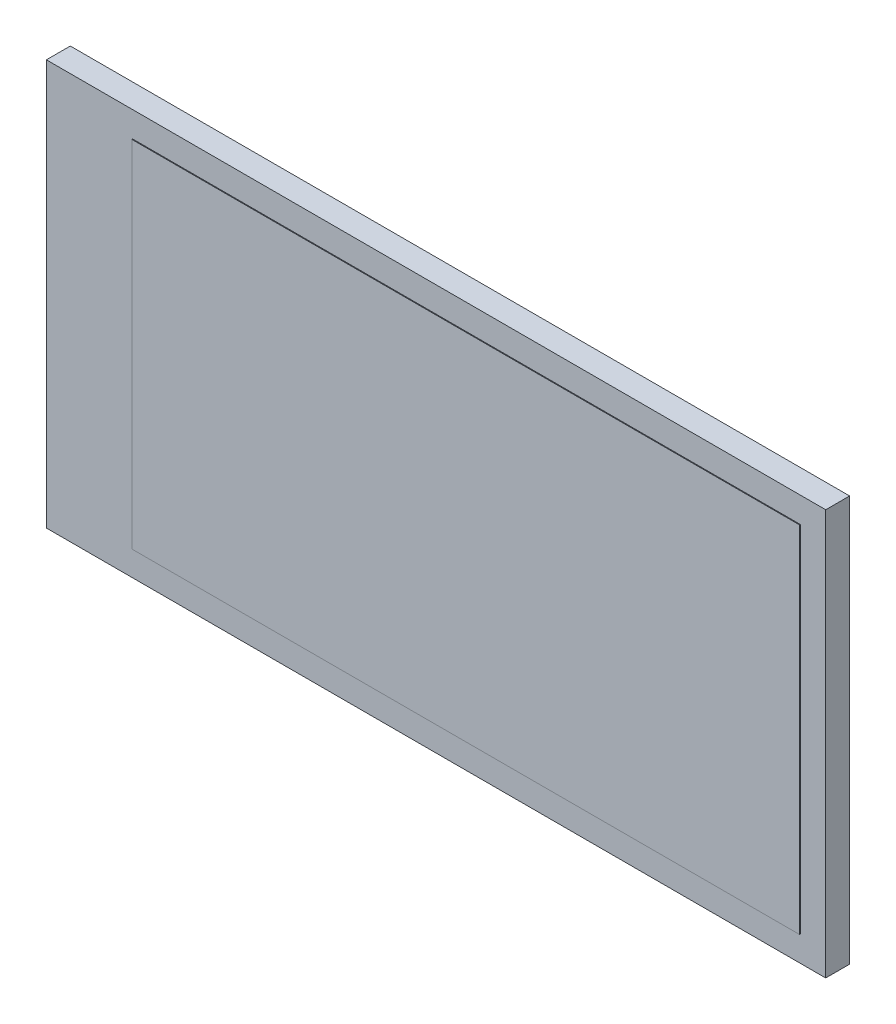
ISO-10303-21;
HEADER;
FILE_DESCRIPTION(('STEP AP214'),'2;1');
FILE_NAME('part.step','',(''),(''),'','','');
FILE_SCHEMA(('AUTOMOTIVE_DESIGN { 1 0 10303 214 1 1 1 1 }'));
ENDSEC;
DATA;
#1=APPLICATION_CONTEXT('core data for automotive mechanical design processes');
#2=APPLICATION_PROTOCOL_DEFINITION('international standard','automotive_design',2000,#1);
#3=PRODUCT_CONTEXT('',#1,'mechanical');
#4=PRODUCT('Part','Part','',(#3));
#5=PRODUCT_RELATED_PRODUCT_CATEGORY('part','',(#4));
#6=PRODUCT_DEFINITION_FORMATION('','',#4);
#7=PRODUCT_DEFINITION_CONTEXT('part definition',#1,'design');
#8=PRODUCT_DEFINITION('design','',#6,#7);
#9=PRODUCT_DEFINITION_SHAPE('','',#8);
#10=(LENGTH_UNIT() NAMED_UNIT(*) SI_UNIT(.MILLI.,.METRE.));
#11=(NAMED_UNIT(*) PLANE_ANGLE_UNIT() SI_UNIT($,.RADIAN.));
#12=(NAMED_UNIT(*) SI_UNIT($,.STERADIAN.) SOLID_ANGLE_UNIT());
#13=UNCERTAINTY_MEASURE_WITH_UNIT(LENGTH_MEASURE(1.E-05),#10,'distance_accuracy_value','');
#14=(GEOMETRIC_REPRESENTATION_CONTEXT(3) GLOBAL_UNCERTAINTY_ASSIGNED_CONTEXT((#13)) GLOBAL_UNIT_ASSIGNED_CONTEXT((#10,
#11,#12)) REPRESENTATION_CONTEXT('',''));
#15=CARTESIAN_POINT('',(0.,0.,0.));
#16=DIRECTION('',(0.,0.,1.));
#17=DIRECTION('',(1.,0.,0.));
#18=AXIS2_PLACEMENT_3D('',#15,#16,#17);
#19=CARTESIAN_POINT('',(0.,0.,1.53));
#20=DIRECTION('',(0.,0.,-1.));
#21=DIRECTION('',(-1.,0.,0.));
#22=AXIS2_PLACEMENT_3D('',#19,#20,#21);
#23=PLANE('',#22);
#24=DIRECTION('',(0.,1.,0.));
#25=VECTOR('',#24,1.);
#26=CARTESIAN_POINT('',(24.935,-12.975,1.53));
#27=LINE('',#26,#25);
#28=CARTESIAN_POINT('',(24.935,-12.975,1.53));
#29=VERTEX_POINT('',#28);
#30=CARTESIAN_POINT('',(24.935,12.975,1.53));
#31=VERTEX_POINT('',#30);
#32=EDGE_CURVE('E140',#29,#31,#27,.T.);
#33=ORIENTED_EDGE('',*,*,#32,.T.);
#34=DIRECTION('',(-1.,0.,0.));
#35=VECTOR('',#34,1.);
#36=CARTESIAN_POINT('',(-24.935,12.975,1.53));
#37=LINE('',#36,#35);
#38=CARTESIAN_POINT('',(-24.935,12.975,1.53));
#39=VERTEX_POINT('',#38);
#40=EDGE_CURVE('E144',#31,#39,#37,.T.);
#41=ORIENTED_EDGE('',*,*,#40,.T.);
#42=DIRECTION('',(0.,-1.,0.));
#43=VECTOR('',#42,1.);
#44=CARTESIAN_POINT('',(-24.935,-12.975,1.53));
#45=LINE('',#44,#43);
#46=CARTESIAN_POINT('',(-24.935,-12.975,1.53));
#47=VERTEX_POINT('',#46);
#48=EDGE_CURVE('E148',#39,#47,#45,.T.);
#49=ORIENTED_EDGE('',*,*,#48,.T.);
#50=DIRECTION('',(1.,0.,0.));
#51=VECTOR('',#50,1.);
#52=CARTESIAN_POINT('',(-24.935,-12.975,1.53));
#53=LINE('',#52,#51);
#54=EDGE_CURVE('E151',#47,#29,#53,.T.);
#55=ORIENTED_EDGE('',*,*,#54,.T.);
#56=EDGE_LOOP('',(#33,#41,#49,#55));
#57=FACE_BOUND('',#56,.T.);
#58=DIRECTION('',(0.,1.,0.));
#59=VECTOR('',#58,1.);
#60=CARTESIAN_POINT('',(23.3068668653562,11.3480878409807,1.53));
#61=LINE('',#60,#59);
#62=CARTESIAN_POINT('',(23.3068668653562,-11.3519121590193,1.53));
#63=VERTEX_POINT('',#62);
#64=CARTESIAN_POINT('',(23.3068668653562,11.3480878409807,1.53));
#65=VERTEX_POINT('',#64);
#66=EDGE_CURVE('E54',#63,#65,#61,.T.);
#67=ORIENTED_EDGE('',*,*,#66,.F.);
#68=DIRECTION('',(1.,0.,0.));
#69=VECTOR('',#68,1.);
#70=CARTESIAN_POINT('',(-19.4131331346438,-11.3519121590193,1.53));
#71=LINE('',#70,#69);
#72=CARTESIAN_POINT('',(-19.4131331346438,-11.3519121590193,1.53));
#73=VERTEX_POINT('',#72);
#74=EDGE_CURVE('E58',#73,#63,#71,.T.);
#75=ORIENTED_EDGE('',*,*,#74,.F.);
#76=DIRECTION('',(0.,-1.,0.));
#77=VECTOR('',#76,1.);
#78=CARTESIAN_POINT('',(-19.4131331346438,11.3480878409807,1.53));
#79=LINE('',#78,#77);
#80=CARTESIAN_POINT('',(-19.4131331346438,11.3480878409807,1.53));
#81=VERTEX_POINT('',#80);
#82=EDGE_CURVE('E297',#81,#73,#79,.T.);
#83=ORIENTED_EDGE('',*,*,#82,.F.);
#84=DIRECTION('',(-1.,0.,0.));
#85=VECTOR('',#84,1.);
#86=CARTESIAN_POINT('',(-19.4131331346438,11.3480878409807,1.53));
#87=LINE('',#86,#85);
#88=EDGE_CURVE('E307',#65,#81,#87,.T.);
#89=ORIENTED_EDGE('',*,*,#88,.F.);
#90=EDGE_LOOP('',(#67,#75,#83,#89));
#91=FACE_BOUND('',#90,.T.);
#92=ADVANCED_FACE('F38',(#57,#91),#23,.F.);
#93=CARTESIAN_POINT('',(24.935,-12.975,1.53));
#94=DIRECTION('',(-1.,0.,0.));
#95=DIRECTION('',(0.,0.,1.));
#96=AXIS2_PLACEMENT_3D('',#93,#94,#95);
#97=PLANE('',#96);
#98=DIRECTION('',(0.,1.,0.));
#99=VECTOR('',#98,1.);
#100=CARTESIAN_POINT('',(24.935,-12.975,0.));
#101=LINE('',#100,#99);
#102=CARTESIAN_POINT('',(24.935,-12.975,0.));
#103=VERTEX_POINT('',#102);
#104=CARTESIAN_POINT('',(24.935,12.975,0.));
#105=VERTEX_POINT('',#104);
#106=EDGE_CURVE('E127',#103,#105,#101,.T.);
#107=ORIENTED_EDGE('',*,*,#106,.T.);
#108=DIRECTION('',(0.,0.,-1.));
#109=VECTOR('',#108,1.);
#110=CARTESIAN_POINT('',(24.935,12.975,1.53));
#111=LINE('',#110,#109);
#112=EDGE_CURVE('E11',#31,#105,#111,.T.);
#113=ORIENTED_EDGE('',*,*,#112,.F.);
#114=ORIENTED_EDGE('',*,*,#32,.F.);
#115=DIRECTION('',(0.,0.,-1.));
#116=VECTOR('',#115,1.);
#117=CARTESIAN_POINT('',(24.935,-12.975,1.53));
#118=LINE('',#117,#116);
#119=EDGE_CURVE('E153',#29,#103,#118,.T.);
#120=ORIENTED_EDGE('',*,*,#119,.T.);
#121=EDGE_LOOP('',(#107,#113,#114,#120));
#122=FACE_BOUND('',#121,.T.);
#123=ADVANCED_FACE('F40',(#122),#97,.F.);
#124=CARTESIAN_POINT('',(-24.935,12.975,1.53));
#125=DIRECTION('',(0.,-1.,0.));
#126=DIRECTION('',(0.,0.,-1.));
#127=AXIS2_PLACEMENT_3D('',#124,#125,#126);
#128=PLANE('',#127);
#129=DIRECTION('',(-1.,0.,0.));
#130=VECTOR('',#129,1.);
#131=CARTESIAN_POINT('',(-24.935,12.975,0.));
#132=LINE('',#131,#130);
#133=CARTESIAN_POINT('',(-24.935,12.975,0.));
#134=VERTEX_POINT('',#133);
#135=EDGE_CURVE('E133',#105,#134,#132,.T.);
#136=ORIENTED_EDGE('',*,*,#135,.T.);
#137=DIRECTION('',(0.,0.,-1.));
#138=VECTOR('',#137,1.);
#139=CARTESIAN_POINT('',(-24.935,12.975,1.53));
#140=LINE('',#139,#138);
#141=EDGE_CURVE('E47',#39,#134,#140,.T.);
#142=ORIENTED_EDGE('',*,*,#141,.F.);
#143=ORIENTED_EDGE('',*,*,#40,.F.);
#144=ORIENTED_EDGE('',*,*,#112,.T.);
#145=EDGE_LOOP('',(#136,#142,#143,#144));
#146=FACE_BOUND('',#145,.T.);
#147=ADVANCED_FACE('F187',(#146),#128,.F.);
#148=CARTESIAN_POINT('',(-24.935,-12.975,1.53));
#149=DIRECTION('',(1.,0.,0.));
#150=DIRECTION('',(0.,0.,-1.));
#151=AXIS2_PLACEMENT_3D('',#148,#149,#150);
#152=PLANE('',#151);
#153=DIRECTION('',(0.,-1.,0.));
#154=VECTOR('',#153,1.);
#155=CARTESIAN_POINT('',(-24.935,-12.975,0.));
#156=LINE('',#155,#154);
#157=CARTESIAN_POINT('',(-24.935,-12.975,0.));
#158=VERTEX_POINT('',#157);
#159=EDGE_CURVE('E157',#134,#158,#156,.T.);
#160=ORIENTED_EDGE('',*,*,#159,.T.);
#161=DIRECTION('',(0.,0.,-1.));
#162=VECTOR('',#161,1.);
#163=CARTESIAN_POINT('',(-24.935,-12.975,1.53));
#164=LINE('',#163,#162);
#165=EDGE_CURVE('E164',#47,#158,#164,.T.);
#166=ORIENTED_EDGE('',*,*,#165,.F.);
#167=ORIENTED_EDGE('',*,*,#48,.F.);
#168=ORIENTED_EDGE('',*,*,#141,.T.);
#169=EDGE_LOOP('',(#160,#166,#167,#168));
#170=FACE_BOUND('',#169,.T.);
#171=ADVANCED_FACE('F172',(#170),#152,.F.);
#172=CARTESIAN_POINT('',(-24.935,-12.975,1.53));
#173=DIRECTION('',(0.,1.,0.));
#174=DIRECTION('',(0.,0.,1.));
#175=AXIS2_PLACEMENT_3D('',#172,#173,#174);
#176=PLANE('',#175);
#177=DIRECTION('',(1.,0.,0.));
#178=VECTOR('',#177,1.);
#179=CARTESIAN_POINT('',(-24.935,-12.975,0.));
#180=LINE('',#179,#178);
#181=EDGE_CURVE('E145',#158,#103,#180,.T.);
#182=ORIENTED_EDGE('',*,*,#181,.T.);
#183=ORIENTED_EDGE('',*,*,#119,.F.);
#184=ORIENTED_EDGE('',*,*,#54,.F.);
#185=ORIENTED_EDGE('',*,*,#165,.T.);
#186=EDGE_LOOP('',(#182,#183,#184,#185));
#187=FACE_BOUND('',#186,.T.);
#188=ADVANCED_FACE('F181',(#187),#176,.F.);
#189=CARTESIAN_POINT('',(0.,0.,0.));
#190=DIRECTION('',(0.,0.,-1.));
#191=DIRECTION('',(-1.,0.,0.));
#192=AXIS2_PLACEMENT_3D('',#189,#190,#191);
#193=PLANE('',#192);
#194=ORIENTED_EDGE('',*,*,#106,.F.);
#195=ORIENTED_EDGE('',*,*,#181,.F.);
#196=ORIENTED_EDGE('',*,*,#159,.F.);
#197=ORIENTED_EDGE('',*,*,#135,.F.);
#198=EDGE_LOOP('',(#194,#195,#196,#197));
#199=FACE_BOUND('',#198,.T.);
#200=ADVANCED_FACE('F178',(#199),#193,.T.);
#201=CARTESIAN_POINT('',(23.3068668653562,11.3480878409807,1.58));
#202=DIRECTION('',(-1.,0.,0.));
#203=DIRECTION('',(0.,-1.,0.));
#204=AXIS2_PLACEMENT_3D('',#201,#202,#203);
#205=PLANE('',#204);
#206=ORIENTED_EDGE('',*,*,#66,.T.);
#207=DIRECTION('',(0.,0.,-1.));
#208=VECTOR('',#207,1.);
#209=CARTESIAN_POINT('',(23.3068668653562,11.3480878409807,1.58));
#210=LINE('',#209,#208);
#211=CARTESIAN_POINT('',(23.3068668653562,11.3480878409807,1.58));
#212=VERTEX_POINT('',#211);
#213=EDGE_CURVE('E107',#212,#65,#210,.T.);
#214=ORIENTED_EDGE('',*,*,#213,.F.);
#215=DIRECTION('',(0.,1.,0.));
#216=VECTOR('',#215,1.);
#217=CARTESIAN_POINT('',(23.3068668653562,11.3480878409807,1.58));
#218=LINE('',#217,#216);
#219=CARTESIAN_POINT('',(23.3068668653562,-11.3519121590193,1.58));
#220=VERTEX_POINT('',#219);
#221=EDGE_CURVE('E114',#220,#212,#218,.T.);
#222=ORIENTED_EDGE('',*,*,#221,.F.);
#223=DIRECTION('',(0.,0.,-1.));
#224=VECTOR('',#223,1.);
#225=CARTESIAN_POINT('',(23.3068668653562,-11.3519121590193,1.58));
#226=LINE('',#225,#224);
#227=EDGE_CURVE('E294',#220,#63,#226,.T.);
#228=ORIENTED_EDGE('',*,*,#227,.T.);
#229=EDGE_LOOP('',(#206,#214,#222,#228));
#230=FACE_BOUND('',#229,.T.);
#231=ADVANCED_FACE('F125',(#230),#205,.F.);
#232=CARTESIAN_POINT('',(-19.4131331346438,11.3480878409807,1.58));
#233=DIRECTION('',(0.,-1.,0.));
#234=DIRECTION('',(0.,0.,-1.));
#235=AXIS2_PLACEMENT_3D('',#232,#233,#234);
#236=PLANE('',#235);
#237=ORIENTED_EDGE('',*,*,#88,.T.);
#238=DIRECTION('',(0.,0.,-1.));
#239=VECTOR('',#238,1.);
#240=CARTESIAN_POINT('',(-19.4131331346438,11.3480878409807,1.58));
#241=LINE('',#240,#239);
#242=CARTESIAN_POINT('',(-19.4131331346438,11.3480878409807,1.58));
#243=VERTEX_POINT('',#242);
#244=EDGE_CURVE('E109',#243,#81,#241,.T.);
#245=ORIENTED_EDGE('',*,*,#244,.F.);
#246=DIRECTION('',(-1.,0.,0.));
#247=VECTOR('',#246,1.);
#248=CARTESIAN_POINT('',(-19.4131331346438,11.3480878409807,1.58));
#249=LINE('',#248,#247);
#250=EDGE_CURVE('E102',#212,#243,#249,.T.);
#251=ORIENTED_EDGE('',*,*,#250,.F.);
#252=ORIENTED_EDGE('',*,*,#213,.T.);
#253=EDGE_LOOP('',(#237,#245,#251,#252));
#254=FACE_BOUND('',#253,.T.);
#255=ADVANCED_FACE('F105',(#254),#236,.F.);
#256=CARTESIAN_POINT('',(-19.4131331346438,11.3480878409807,1.58));
#257=DIRECTION('',(1.,0.,0.));
#258=DIRECTION('',(0.,1.,0.));
#259=AXIS2_PLACEMENT_3D('',#256,#257,#258);
#260=PLANE('',#259);
#261=ORIENTED_EDGE('',*,*,#82,.T.);
#262=DIRECTION('',(0.,0.,-1.));
#263=VECTOR('',#262,1.);
#264=CARTESIAN_POINT('',(-19.4131331346438,-11.3519121590193,1.58));
#265=LINE('',#264,#263);
#266=CARTESIAN_POINT('',(-19.4131331346438,-11.3519121590193,1.58));
#267=VERTEX_POINT('',#266);
#268=EDGE_CURVE('E136',#267,#73,#265,.T.);
#269=ORIENTED_EDGE('',*,*,#268,.F.);
#270=DIRECTION('',(0.,-1.,0.));
#271=VECTOR('',#270,1.);
#272=CARTESIAN_POINT('',(-19.4131331346438,11.3480878409807,1.58));
#273=LINE('',#272,#271);
#274=EDGE_CURVE('E113',#243,#267,#273,.T.);
#275=ORIENTED_EDGE('',*,*,#274,.F.);
#276=ORIENTED_EDGE('',*,*,#244,.T.);
#277=EDGE_LOOP('',(#261,#269,#275,#276));
#278=FACE_BOUND('',#277,.T.);
#279=ADVANCED_FACE('F220',(#278),#260,.F.);
#280=CARTESIAN_POINT('',(-19.4131331346438,-11.3519121590193,1.58));
#281=DIRECTION('',(0.,1.,0.));
#282=DIRECTION('',(0.,0.,1.));
#283=AXIS2_PLACEMENT_3D('',#280,#281,#282);
#284=PLANE('',#283);
#285=ORIENTED_EDGE('',*,*,#74,.T.);
#286=ORIENTED_EDGE('',*,*,#227,.F.);
#287=DIRECTION('',(1.,0.,0.));
#288=VECTOR('',#287,1.);
#289=CARTESIAN_POINT('',(-19.4131331346438,-11.3519121590193,1.58));
#290=LINE('',#289,#288);
#291=EDGE_CURVE('E119',#267,#220,#290,.T.);
#292=ORIENTED_EDGE('',*,*,#291,.F.);
#293=ORIENTED_EDGE('',*,*,#268,.T.);
#294=EDGE_LOOP('',(#285,#286,#292,#293));
#295=FACE_BOUND('',#294,.T.);
#296=ADVANCED_FACE('F225',(#295),#284,.F.);
#297=CARTESIAN_POINT('',(0.,0.,1.58));
#298=DIRECTION('',(0.,0.,1.));
#299=DIRECTION('',(1.,0.,0.));
#300=AXIS2_PLACEMENT_3D('',#297,#298,#299);
#301=PLANE('',#300);
#302=ORIENTED_EDGE('',*,*,#221,.T.);
#303=ORIENTED_EDGE('',*,*,#250,.T.);
#304=ORIENTED_EDGE('',*,*,#274,.T.);
#305=ORIENTED_EDGE('',*,*,#291,.T.);
#306=EDGE_LOOP('',(#302,#303,#304,#305));
#307=FACE_BOUND('',#306,.T.);
#308=ADVANCED_FACE('F117',(#307),#301,.T.);
#309=CLOSED_SHELL('',(#92,#123,#147,#171,#188,#200,#231,#255,#279,#296,#308));
#310=MANIFOLD_SOLID_BREP('B2',#309);
#311=ADVANCED_BREP_SHAPE_REPRESENTATION('',(#18,#310),#14);
#312=SHAPE_DEFINITION_REPRESENTATION(#9,#311);
ENDSEC;
END-ISO-10303-21;
